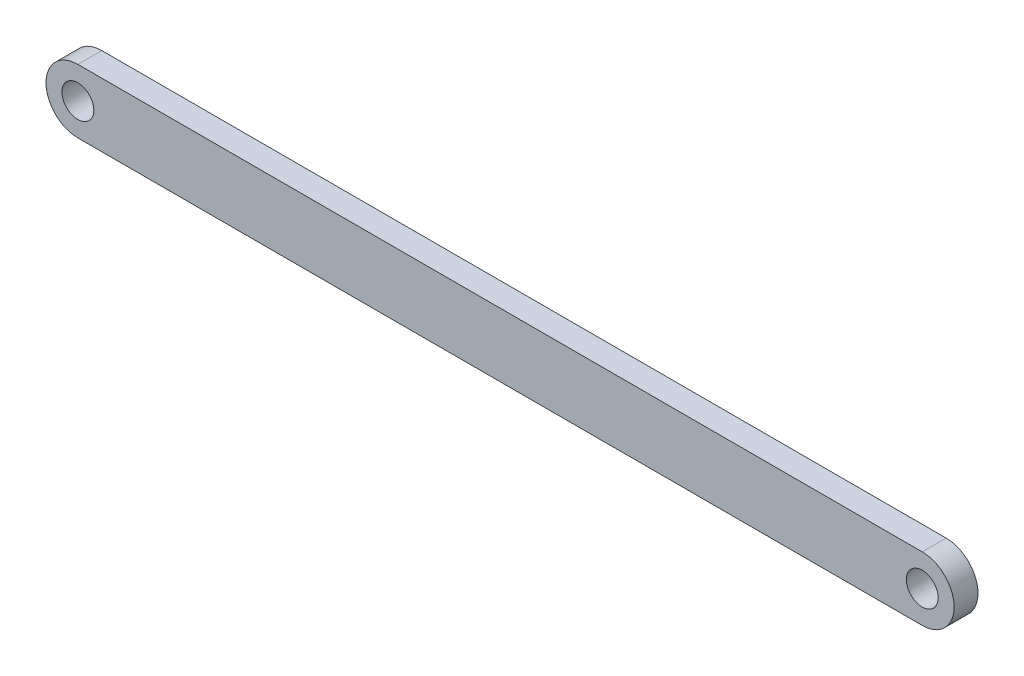
ISO-10303-21;
HEADER;
FILE_DESCRIPTION(('STEP AP214'),'2;1');
FILE_NAME('part.step','',(''),(''),'','','');
FILE_SCHEMA(('AUTOMOTIVE_DESIGN { 1 0 10303 214 1 1 1 1 }'));
ENDSEC;
DATA;
#1=APPLICATION_CONTEXT('core data for automotive mechanical design processes');
#2=APPLICATION_PROTOCOL_DEFINITION('international standard','automotive_design',2000,#1);
#3=PRODUCT_CONTEXT('',#1,'mechanical');
#4=PRODUCT('Part','Part','',(#3));
#5=PRODUCT_RELATED_PRODUCT_CATEGORY('part','',(#4));
#6=PRODUCT_DEFINITION_FORMATION('','',#4);
#7=PRODUCT_DEFINITION_CONTEXT('part definition',#1,'design');
#8=PRODUCT_DEFINITION('design','',#6,#7);
#9=PRODUCT_DEFINITION_SHAPE('','',#8);
#10=(LENGTH_UNIT() NAMED_UNIT(*) SI_UNIT(.MILLI.,.METRE.));
#11=(NAMED_UNIT(*) PLANE_ANGLE_UNIT() SI_UNIT($,.RADIAN.));
#12=(NAMED_UNIT(*) SI_UNIT($,.STERADIAN.) SOLID_ANGLE_UNIT());
#13=UNCERTAINTY_MEASURE_WITH_UNIT(LENGTH_MEASURE(1.E-05),#10,'distance_accuracy_value','');
#14=(GEOMETRIC_REPRESENTATION_CONTEXT(3) GLOBAL_UNCERTAINTY_ASSIGNED_CONTEXT((#13)) GLOBAL_UNIT_ASSIGNED_CONTEXT((#10,
#11,#12)) REPRESENTATION_CONTEXT('',''));
#15=CARTESIAN_POINT('',(0.,0.,0.));
#16=DIRECTION('',(0.,0.,1.));
#17=DIRECTION('',(1.,0.,0.));
#18=AXIS2_PLACEMENT_3D('',#15,#16,#17);
#19=CARTESIAN_POINT('',(-106.,0.,6.));
#20=DIRECTION('',(0.,0.,1.));
#21=DIRECTION('',(1.,0.,0.));
#22=AXIS2_PLACEMENT_3D('',#19,#20,#21);
#23=PLANE('',#22);
#24=CARTESIAN_POINT('',(106.,0.,6.));
#25=DIRECTION('',(0.,0.,1.));
#26=DIRECTION('',(1.,0.,0.));
#27=AXIS2_PLACEMENT_3D('',#24,#25,#26);
#28=CIRCLE('',#27,4.00000000000001);
#29=CARTESIAN_POINT('',(110.,0.,6.));
#30=VERTEX_POINT('',#29);
#31=EDGE_CURVE('E104',#30,#30,#28,.T.);
#32=ORIENTED_EDGE('',*,*,#31,.F.);
#33=EDGE_LOOP('',(#32));
#34=FACE_BOUND('',#33,.T.);
#35=CARTESIAN_POINT('',(-106.,0.,6.));
#36=DIRECTION('',(0.,0.,1.));
#37=DIRECTION('',(1.,0.,0.));
#38=AXIS2_PLACEMENT_3D('',#35,#36,#37);
#39=CIRCLE('',#38,8.00000000000004);
#40=CARTESIAN_POINT('',(-106.,8.00000000000004,6.));
#41=VERTEX_POINT('',#40);
#42=CARTESIAN_POINT('',(-106.,-8.00000000000004,6.));
#43=VERTEX_POINT('',#42);
#44=EDGE_CURVE('E89',#41,#43,#39,.T.);
#45=ORIENTED_EDGE('',*,*,#44,.T.);
#46=DIRECTION('',(1.,0.,0.));
#47=VECTOR('',#46,1.);
#48=CARTESIAN_POINT('',(-106.,-8.00000000000004,6.));
#49=LINE('',#48,#47);
#50=CARTESIAN_POINT('',(106.,-8.,6.));
#51=VERTEX_POINT('',#50);
#52=EDGE_CURVE('E84',#43,#51,#49,.T.);
#53=ORIENTED_EDGE('',*,*,#52,.T.);
#54=CARTESIAN_POINT('',(106.,0.,6.));
#55=DIRECTION('',(0.,0.,1.));
#56=DIRECTION('',(1.,0.,0.));
#57=AXIS2_PLACEMENT_3D('',#54,#55,#56);
#58=CIRCLE('',#57,8.00000000000004);
#59=CARTESIAN_POINT('',(106.,8.00000000000008,6.));
#60=VERTEX_POINT('',#59);
#61=EDGE_CURVE('E87',#51,#60,#58,.T.);
#62=ORIENTED_EDGE('',*,*,#61,.T.);
#63=DIRECTION('',(-1.,0.,0.));
#64=VECTOR('',#63,1.);
#65=CARTESIAN_POINT('',(-106.,8.00000000000004,6.));
#66=LINE('',#65,#64);
#67=EDGE_CURVE('E54',#60,#41,#66,.T.);
#68=ORIENTED_EDGE('',*,*,#67,.T.);
#69=EDGE_LOOP('',(#45,#53,#62,#68));
#70=FACE_BOUND('',#69,.T.);
#71=CARTESIAN_POINT('',(-106.,0.,6.));
#72=DIRECTION('',(0.,0.,1.));
#73=DIRECTION('',(1.,0.,0.));
#74=AXIS2_PLACEMENT_3D('',#71,#72,#73);
#75=CIRCLE('',#74,4.00000000000001);
#76=CARTESIAN_POINT('',(-102.,0.,6.));
#77=VERTEX_POINT('',#76);
#78=EDGE_CURVE('E119',#77,#77,#75,.T.);
#79=ORIENTED_EDGE('',*,*,#78,.F.);
#80=EDGE_LOOP('',(#79));
#81=FACE_BOUND('',#80,.T.);
#82=ADVANCED_FACE('F37',(#34,#70,#81),#23,.T.);
#83=CARTESIAN_POINT('',(-106.,0.,0.));
#84=DIRECTION('',(0.,0.,1.));
#85=DIRECTION('',(1.,0.,0.));
#86=AXIS2_PLACEMENT_3D('',#83,#84,#85);
#87=PLANE('',#86);
#88=CARTESIAN_POINT('',(-106.,0.,0.));
#89=DIRECTION('',(0.,0.,1.));
#90=DIRECTION('',(1.,0.,0.));
#91=AXIS2_PLACEMENT_3D('',#88,#89,#90);
#92=CIRCLE('',#91,8.00000000000004);
#93=CARTESIAN_POINT('',(-106.,8.00000000000004,0.));
#94=VERTEX_POINT('',#93);
#95=CARTESIAN_POINT('',(-106.,-8.00000000000004,0.));
#96=VERTEX_POINT('',#95);
#97=EDGE_CURVE('E101',#94,#96,#92,.T.);
#98=ORIENTED_EDGE('',*,*,#97,.F.);
#99=DIRECTION('',(-1.,0.,0.));
#100=VECTOR('',#99,1.);
#101=CARTESIAN_POINT('',(-106.,8.00000000000004,0.));
#102=LINE('',#101,#100);
#103=CARTESIAN_POINT('',(106.,8.00000000000008,0.));
#104=VERTEX_POINT('',#103);
#105=EDGE_CURVE('E77',#104,#94,#102,.T.);
#106=ORIENTED_EDGE('',*,*,#105,.F.);
#107=CARTESIAN_POINT('',(106.,0.,0.));
#108=DIRECTION('',(0.,0.,1.));
#109=DIRECTION('',(1.,0.,0.));
#110=AXIS2_PLACEMENT_3D('',#107,#108,#109);
#111=CIRCLE('',#110,8.00000000000004);
#112=CARTESIAN_POINT('',(106.,-8.,0.));
#113=VERTEX_POINT('',#112);
#114=EDGE_CURVE('E71',#113,#104,#111,.T.);
#115=ORIENTED_EDGE('',*,*,#114,.F.);
#116=DIRECTION('',(1.,0.,0.));
#117=VECTOR('',#116,1.);
#118=CARTESIAN_POINT('',(-106.,-8.00000000000004,0.));
#119=LINE('',#118,#117);
#120=EDGE_CURVE('E93',#96,#113,#119,.T.);
#121=ORIENTED_EDGE('',*,*,#120,.F.);
#122=EDGE_LOOP('',(#98,#106,#115,#121));
#123=FACE_BOUND('',#122,.T.);
#124=CARTESIAN_POINT('',(106.,0.,0.));
#125=DIRECTION('',(0.,0.,1.));
#126=DIRECTION('',(1.,0.,0.));
#127=AXIS2_PLACEMENT_3D('',#124,#125,#126);
#128=CIRCLE('',#127,4.00000000000001);
#129=CARTESIAN_POINT('',(110.,0.,0.));
#130=VERTEX_POINT('',#129);
#131=EDGE_CURVE('E116',#130,#130,#128,.T.);
#132=ORIENTED_EDGE('',*,*,#131,.T.);
#133=EDGE_LOOP('',(#132));
#134=FACE_BOUND('',#133,.T.);
#135=CARTESIAN_POINT('',(-106.,0.,0.));
#136=DIRECTION('',(0.,0.,1.));
#137=DIRECTION('',(1.,0.,0.));
#138=AXIS2_PLACEMENT_3D('',#135,#136,#137);
#139=CIRCLE('',#138,4.00000000000001);
#140=CARTESIAN_POINT('',(-102.,0.,0.));
#141=VERTEX_POINT('',#140);
#142=EDGE_CURVE('E122',#141,#141,#139,.T.);
#143=ORIENTED_EDGE('',*,*,#142,.T.);
#144=EDGE_LOOP('',(#143));
#145=FACE_BOUND('',#144,.T.);
#146=ADVANCED_FACE('F112',(#123,#134,#145),#87,.F.);
#147=CARTESIAN_POINT('',(-106.,0.,6.));
#148=DIRECTION('',(0.,0.,-1.));
#149=DIRECTION('',(-1.,0.,0.));
#150=AXIS2_PLACEMENT_3D('',#147,#148,#149);
#151=CYLINDRICAL_SURFACE('',#150,8.00000000000004);
#152=ORIENTED_EDGE('',*,*,#97,.T.);
#153=DIRECTION('',(0.,0.,-1.));
#154=VECTOR('',#153,1.);
#155=CARTESIAN_POINT('',(-106.,-8.00000000000004,6.));
#156=LINE('',#155,#154);
#157=EDGE_CURVE('E11',#43,#96,#156,.T.);
#158=ORIENTED_EDGE('',*,*,#157,.F.);
#159=ORIENTED_EDGE('',*,*,#44,.F.);
#160=DIRECTION('',(0.,0.,-1.));
#161=VECTOR('',#160,1.);
#162=CARTESIAN_POINT('',(-106.,8.00000000000004,6.));
#163=LINE('',#162,#161);
#164=EDGE_CURVE('E97',#41,#94,#163,.T.);
#165=ORIENTED_EDGE('',*,*,#164,.T.);
#166=EDGE_LOOP('',(#152,#158,#159,#165));
#167=FACE_BOUND('',#166,.T.);
#168=ADVANCED_FACE('F39',(#167),#151,.T.);
#169=CARTESIAN_POINT('',(-106.,-8.00000000000004,6.));
#170=DIRECTION('',(0.,1.,0.));
#171=DIRECTION('',(-1.,0.,0.));
#172=AXIS2_PLACEMENT_3D('',#169,#170,#171);
#173=PLANE('',#172);
#174=ORIENTED_EDGE('',*,*,#120,.T.);
#175=DIRECTION('',(0.,0.,-1.));
#176=VECTOR('',#175,1.);
#177=CARTESIAN_POINT('',(106.,-8.,6.));
#178=LINE('',#177,#176);
#179=EDGE_CURVE('E46',#51,#113,#178,.T.);
#180=ORIENTED_EDGE('',*,*,#179,.F.);
#181=ORIENTED_EDGE('',*,*,#52,.F.);
#182=ORIENTED_EDGE('',*,*,#157,.T.);
#183=EDGE_LOOP('',(#174,#180,#181,#182));
#184=FACE_BOUND('',#183,.T.);
#185=ADVANCED_FACE('F92',(#184),#173,.F.);
#186=CARTESIAN_POINT('',(106.,0.,6.));
#187=DIRECTION('',(0.,0.,-1.));
#188=DIRECTION('',(-1.,0.,0.));
#189=AXIS2_PLACEMENT_3D('',#186,#187,#188);
#190=CYLINDRICAL_SURFACE('',#189,8.00000000000004);
#191=ORIENTED_EDGE('',*,*,#114,.T.);
#192=DIRECTION('',(0.,0.,-1.));
#193=VECTOR('',#192,1.);
#194=CARTESIAN_POINT('',(106.,8.00000000000008,6.));
#195=LINE('',#194,#193);
#196=EDGE_CURVE('E94',#60,#104,#195,.T.);
#197=ORIENTED_EDGE('',*,*,#196,.F.);
#198=ORIENTED_EDGE('',*,*,#61,.F.);
#199=ORIENTED_EDGE('',*,*,#179,.T.);
#200=EDGE_LOOP('',(#191,#197,#198,#199));
#201=FACE_BOUND('',#200,.T.);
#202=ADVANCED_FACE('F95',(#201),#190,.T.);
#203=CARTESIAN_POINT('',(-106.,8.00000000000004,6.));
#204=DIRECTION('',(0.,-1.,0.));
#205=DIRECTION('',(1.,0.,0.));
#206=AXIS2_PLACEMENT_3D('',#203,#204,#205);
#207=PLANE('',#206);
#208=ORIENTED_EDGE('',*,*,#105,.T.);
#209=ORIENTED_EDGE('',*,*,#164,.F.);
#210=ORIENTED_EDGE('',*,*,#67,.F.);
#211=ORIENTED_EDGE('',*,*,#196,.T.);
#212=EDGE_LOOP('',(#208,#209,#210,#211));
#213=FACE_BOUND('',#212,.T.);
#214=ADVANCED_FACE('F109',(#213),#207,.F.);
#215=CARTESIAN_POINT('',(106.,0.,6.));
#216=DIRECTION('',(0.,0.,-1.));
#217=DIRECTION('',(-1.,0.,0.));
#218=AXIS2_PLACEMENT_3D('',#215,#216,#217);
#219=CYLINDRICAL_SURFACE('',#218,4.00000000000001);
#220=ORIENTED_EDGE('',*,*,#31,.T.);
#221=EDGE_LOOP('',(#220));
#222=FACE_BOUND('',#221,.T.);
#223=ORIENTED_EDGE('',*,*,#131,.F.);
#224=EDGE_LOOP('',(#223));
#225=FACE_BOUND('',#224,.T.);
#226=ADVANCED_FACE('F139',(#222,#225),#219,.F.);
#227=CARTESIAN_POINT('',(-106.,0.,6.));
#228=DIRECTION('',(0.,0.,-1.));
#229=DIRECTION('',(-1.,0.,0.));
#230=AXIS2_PLACEMENT_3D('',#227,#228,#229);
#231=CYLINDRICAL_SURFACE('',#230,4.00000000000001);
#232=ORIENTED_EDGE('',*,*,#78,.T.);
#233=EDGE_LOOP('',(#232));
#234=FACE_BOUND('',#233,.T.);
#235=ORIENTED_EDGE('',*,*,#142,.F.);
#236=EDGE_LOOP('',(#235));
#237=FACE_BOUND('',#236,.T.);
#238=ADVANCED_FACE('F128',(#234,#237),#231,.F.);
#239=CLOSED_SHELL('',(#82,#146,#168,#185,#202,#214,#226,#238));
#240=MANIFOLD_SOLID_BREP('B2',#239);
#241=ADVANCED_BREP_SHAPE_REPRESENTATION('',(#18,#240),#14);
#242=SHAPE_DEFINITION_REPRESENTATION(#9,#241);
ENDSEC;
END-ISO-10303-21;
